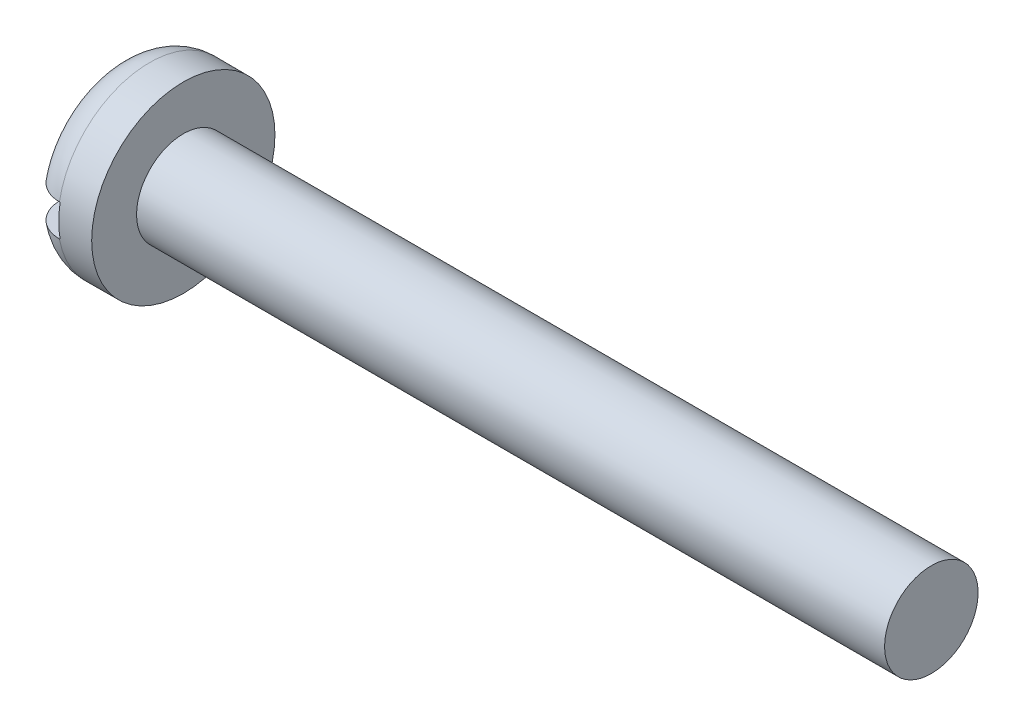
ISO-10303-21;
HEADER;
FILE_DESCRIPTION(('STEP AP214'),'2;1');
FILE_NAME('part.step','',(''),(''),'','','');
FILE_SCHEMA(('AUTOMOTIVE_DESIGN { 1 0 10303 214 1 1 1 1 }'));
ENDSEC;
DATA;
#1=APPLICATION_CONTEXT('core data for automotive mechanical design processes');
#2=APPLICATION_PROTOCOL_DEFINITION('international standard','automotive_design',2000,#1);
#3=PRODUCT_CONTEXT('',#1,'mechanical');
#4=PRODUCT('Part','Part','',(#3));
#5=PRODUCT_RELATED_PRODUCT_CATEGORY('part','',(#4));
#6=PRODUCT_DEFINITION_FORMATION('','',#4);
#7=PRODUCT_DEFINITION_CONTEXT('part definition',#1,'design');
#8=PRODUCT_DEFINITION('design','',#6,#7);
#9=PRODUCT_DEFINITION_SHAPE('','',#8);
#10=(LENGTH_UNIT() NAMED_UNIT(*) SI_UNIT(.MILLI.,.METRE.));
#11=(NAMED_UNIT(*) PLANE_ANGLE_UNIT() SI_UNIT($,.RADIAN.));
#12=(NAMED_UNIT(*) SI_UNIT($,.STERADIAN.) SOLID_ANGLE_UNIT());
#13=UNCERTAINTY_MEASURE_WITH_UNIT(LENGTH_MEASURE(1.E-05),#10,'distance_accuracy_value','');
#14=(GEOMETRIC_REPRESENTATION_CONTEXT(3) GLOBAL_UNCERTAINTY_ASSIGNED_CONTEXT((#13)) GLOBAL_UNIT_ASSIGNED_CONTEXT((#10,
#11,#12)) REPRESENTATION_CONTEXT('',''));
#15=CARTESIAN_POINT('',(0.,0.,0.));
#16=DIRECTION('',(0.,0.,1.));
#17=DIRECTION('',(1.,0.,0.));
#18=AXIS2_PLACEMENT_3D('',#15,#16,#17);
#19=CARTESIAN_POINT('',(1.143,0.5461,-3.1115));
#20=DIRECTION('',(-1.,0.,0.));
#21=DIRECTION('',(0.,0.,1.));
#22=AXIS2_PLACEMENT_3D('',#19,#20,#21);
#23=PLANE('',#22);
#24=DIRECTION('',(0.,0.,1.));
#25=VECTOR('',#24,1.);
#26=CARTESIAN_POINT('',(1.143,0.5461,3.1115));
#27=LINE('',#26,#25);
#28=CARTESIAN_POINT('',(1.143,0.5461,3.06320208931827));
#29=VERTEX_POINT('',#28);
#30=CARTESIAN_POINT('',(1.143,0.5461,-3.06320208931827));
#31=VERTEX_POINT('',#30);
#32=EDGE_CURVE('E65',#29,#31,#27,.F.);
#33=ORIENTED_EDGE('',*,*,#32,.T.);
#34=CARTESIAN_POINT('',(1.143,0.,0.));
#35=DIRECTION('',(-1.,0.,0.));
#36=DIRECTION('',(0.,0.,1.));
#37=AXIS2_PLACEMENT_3D('',#34,#35,#36);
#38=CIRCLE('',#37,3.1115);
#39=CARTESIAN_POINT('',(1.143,-0.5461,-3.06320208931827));
#40=VERTEX_POINT('',#39);
#41=EDGE_CURVE('E75',#31,#40,#38,.T.);
#42=ORIENTED_EDGE('',*,*,#41,.T.);
#43=DIRECTION('',(0.,0.,-1.));
#44=VECTOR('',#43,1.);
#45=CARTESIAN_POINT('',(1.143,-0.5461,-3.1115));
#46=LINE('',#45,#44);
#47=CARTESIAN_POINT('',(1.143,-0.5461,3.06320208931827));
#48=VERTEX_POINT('',#47);
#49=EDGE_CURVE('E73',#40,#48,#46,.F.);
#50=ORIENTED_EDGE('',*,*,#49,.T.);
#51=CARTESIAN_POINT('',(1.143,0.,0.));
#52=DIRECTION('',(-1.,0.,0.));
#53=DIRECTION('',(0.,0.,1.));
#54=AXIS2_PLACEMENT_3D('',#51,#52,#53);
#55=CIRCLE('',#54,3.1115);
#56=EDGE_CURVE('E19',#48,#29,#55,.T.);
#57=ORIENTED_EDGE('',*,*,#56,.T.);
#58=EDGE_LOOP('',(#33,#42,#50,#57));
#59=FACE_BOUND('',#58,.T.);
#60=ADVANCED_FACE('F16',(#59),#23,.T.);
#61=CARTESIAN_POINT('',(1.143,-0.5461,-3.1115));
#62=DIRECTION('',(0.,-1.,0.));
#63=DIRECTION('',(0.,0.,-1.));
#64=AXIS2_PLACEMENT_3D('',#61,#62,#63);
#65=PLANE('',#64);
#66=DIRECTION('',(1.,0.,0.));
#67=VECTOR('',#66,1.);
#68=CARTESIAN_POINT('',(1.143,-0.5461,3.0632020893189));
#69=LINE('',#68,#67);
#70=CARTESIAN_POINT('',(1.1176,-0.5461,3.06320208931827));
#71=VERTEX_POINT('',#70);
#72=EDGE_CURVE('E86',#48,#71,#69,.F.);
#73=ORIENTED_EDGE('',*,*,#72,.F.);
#74=ORIENTED_EDGE('',*,*,#49,.F.);
#75=DIRECTION('',(1.,0.,0.));
#76=VECTOR('',#75,1.);
#77=CARTESIAN_POINT('',(1.143,-0.5461,-3.0632020893189));
#78=LINE('',#77,#76);
#79=CARTESIAN_POINT('',(1.1176,-0.5461,-3.06320208931827));
#80=VERTEX_POINT('',#79);
#81=EDGE_CURVE('E84',#80,#40,#78,.T.);
#82=ORIENTED_EDGE('',*,*,#81,.F.);
#83=CARTESIAN_POINT('',(0.,-0.546100000000001,-1.91765794655883));
#84=CARTESIAN_POINT('',(-4.86585351610282E-07,-0.5461,-1.95062637866364));
#85=CARTESIAN_POINT('',(0.00135014506313673,-0.5461,-1.98358259298573));
#86=CARTESIAN_POINT('',(0.0067686016150952,-0.5461,-2.04927334553177));
#87=CARTESIAN_POINT('',(0.0108366631513076,-0.5461,-2.08200786419976));
#88=CARTESIAN_POINT('',(0.0271349413877521,-0.5461,-2.17954955418893));
#89=CARTESIAN_POINT('',(0.0434592295263024,-0.546100000000001,-2.24372027915941));
#90=CARTESIAN_POINT('',(0.086814129053496,-0.546100000000001,-2.36845554355077));
#91=CARTESIAN_POINT('',(0.113859878601486,-0.5461,-2.4290148441318));
#92=CARTESIAN_POINT('',(0.16190237578884,-0.5461,-2.51559533377862));
#93=CARTESIAN_POINT('',(0.179159773009867,-0.5461,-2.54374276145626));
#94=CARTESIAN_POINT('',(0.216075583473107,-0.5461,-2.59845900628358));
#95=CARTESIAN_POINT('',(0.235736442254006,-0.546099999999999,-2.62502617396701));
#96=CARTESIAN_POINT('',(0.297032177469674,-0.546099999999999,-2.70065627104591));
#97=CARTESIAN_POINT('',(0.341845840618247,-0.5461,-2.74719961308327));
#98=CARTESIAN_POINT('',(0.438810520549853,-0.5461,-2.8318776489374));
#99=CARTESIAN_POINT('',(0.490960095385904,-0.546099999999998,-2.87001399146155));
#100=CARTESIAN_POINT('',(0.572903803855602,-0.546099999999999,-2.91965052665071));
#101=CARTESIAN_POINT('',(0.600532288418432,-0.5461,-2.93481477161741));
#102=CARTESIAN_POINT('',(0.656951694036354,-0.5461,-2.96272487096258));
#103=CARTESIAN_POINT('',(0.685741576017605,-0.5461,-2.975472831381));
#104=CARTESIAN_POINT('',(0.773570258061908,-0.546099999999999,-3.00993924201506));
#105=CARTESIAN_POINT('',(0.834141002763517,-0.546099999999995,-3.02792433866405));
#106=CARTESIAN_POINT('',(0.93224294473862,-0.546100000000005,-3.04812139634171));
#107=CARTESIAN_POINT('',(0.969113431249231,-0.546100000000012,-3.05377399627333));
#108=CARTESIAN_POINT('',(1.0431813456879,-0.546099999999988,-3.06131179915604));
#109=CARTESIAN_POINT('',(1.08037819684364,-0.546099999999956,-3.06320266962121));
#110=CARTESIAN_POINT('',(1.11759999999993,-0.546099999999882,-3.06320208931766));
#111=B_SPLINE_CURVE_WITH_KNOTS('',3,(#83,#84,#85,#86,#87,#88,#89,#90,#91,#92,#93,#94,#95,#96,
#97,#98,#99,#100,#101,#102,#103,#104,#105,#106,#107,#108,#109,#110),.UNSPECIFIED.,.F.,.F.,(4,2,
2,2,2,2,2,2,2,2,2,2,2,4),(0.,0.0988519722488281,0.197712553611454,0.39535841236402,
0.593284336719768,0.692224546821263,0.791266280565482,0.984091274992725,1.17687842055746,
1.27132649663735,1.36569186911685,1.55417017095813,1.66590679181832,1.77747493966118),.UNSPECIFIED.);
#112=CARTESIAN_POINT('',(0.,-0.5461,-1.91765794655883));
#113=VERTEX_POINT('',#112);
#114=EDGE_CURVE('E80',#113,#80,#111,.T.);
#115=ORIENTED_EDGE('',*,*,#114,.F.);
#116=DIRECTION('',(0.,0.,1.));
#117=VECTOR('',#116,1.);
#118=CARTESIAN_POINT('',(0.,-0.5461,0.));
#119=LINE('',#118,#117);
#120=CARTESIAN_POINT('',(0.,-0.5461,1.91765794655883));
#121=VERTEX_POINT('',#120);
#122=EDGE_CURVE('E129',#121,#113,#119,.F.);
#123=ORIENTED_EDGE('',*,*,#122,.F.);
#124=CARTESIAN_POINT('',(1.1176,-0.546100000000001,3.06320208931765));
#125=CARTESIAN_POINT('',(1.08655171124809,-0.5461,3.06320255198409));
#126=CARTESIAN_POINT('',(1.05551728560532,-0.5461,3.06188720128157));
#127=CARTESIAN_POINT('',(0.993673927460179,-0.5461,3.05664149504699));
#128=CARTESIAN_POINT('',(0.962864968757371,-0.5461,3.05271144839587));
#129=CARTESIAN_POINT('',(0.871181911441144,-0.5461,3.03704424031997));
#130=CARTESIAN_POINT('',(0.810928303907086,-0.5461,3.02142986340667));
#131=CARTESIAN_POINT('',(0.693879264891046,-0.5461,2.98029734378209));
#132=CARTESIAN_POINT('',(0.637085147748696,-0.5461,2.95477546380094));
#133=CARTESIAN_POINT('',(0.555746384874976,-0.5461,2.90969338362253));
#134=CARTESIAN_POINT('',(0.529271204166917,-0.5461,2.89352936338644));
#135=CARTESIAN_POINT('',(0.477738255257114,-0.5461,2.85903394400874));
#136=CARTESIAN_POINT('',(0.452681777400283,-0.546099999999999,2.84070061720285));
#137=CARTESIAN_POINT('',(0.379729505108277,-0.546099999999998,2.78249002227685));
#138=CARTESIAN_POINT('',(0.334253602645311,-0.5461,2.73951479197486));
#139=CARTESIAN_POINT('',(0.251047861028869,-0.5461,2.6466262571059));
#140=CARTESIAN_POINT('',(0.213319017149381,-0.5461,2.59671206246145));
#141=CARTESIAN_POINT('',(0.163000801311553,-0.5461,2.51736960814786));
#142=CARTESIAN_POINT('',(0.147176090622323,-0.5461,2.48994586030756));
#143=CARTESIAN_POINT('',(0.1178622083208,-0.5461,2.43391145213047));
#144=CARTESIAN_POINT('',(0.104370920288527,-0.5461,2.40530189683708));
#145=CARTESIAN_POINT('',(0.0674933170593663,-0.5461,2.3179319352955));
#146=CARTESIAN_POINT('',(0.0476880002718061,-0.5461,2.25760606202138));
#147=CARTESIAN_POINT('',(0.0219024844533768,-0.5461,2.15053081830774));
#148=CARTESIAN_POINT('',(0.0136727204926522,-0.5461,2.10429914924586));
#149=CARTESIAN_POINT('',(0.00272220980386176,-0.5461,2.01126891000954));
#150=CARTESIAN_POINT('',(-8.19609578063764E-06,-0.5461,1.96447147929644));
#151=CARTESIAN_POINT('',(0.,-0.546100000000001,1.91765794655883));
#152=B_SPLINE_CURVE_WITH_KNOTS('',3,(#124,#125,#126,#127,#128,#129,#130,#131,#132,#133,#134,
#135,#136,#137,#138,#139,#140,#141,#142,#143,#144,#145,#146,#147,#148,#149,#150,#151),
.UNSPECIFIED.,.F.,.F.,(4,2,2,2,2,2,2,2,2,2,2,2,2,4),(0.,0.093089547880753,0.186168100799708,
0.371959999085716,0.557822049279223,0.65078586535665,0.743832919173213,0.930614005390173,
1.11741907260644,1.2123084639089,1.30711133375681,1.49663233650843,1.63720397872095,
1.77752850229943),.UNSPECIFIED.);
#153=EDGE_CURVE('E189',#71,#121,#152,.T.);
#154=ORIENTED_EDGE('',*,*,#153,.F.);
#155=EDGE_LOOP('',(#73,#74,#82,#115,#123,#154));
#156=FACE_BOUND('',#155,.T.);
#157=ADVANCED_FACE('F154',(#156),#65,.F.);
#158=CARTESIAN_POINT('',(0.,0.,0.));
#159=DIRECTION('',(-1.,0.,0.));
#160=DIRECTION('',(0.,0.,1.));
#161=AXIS2_PLACEMENT_3D('',#158,#159,#160);
#162=PLANE('',#161);
#163=ORIENTED_EDGE('',*,*,#122,.T.);
#164=CARTESIAN_POINT('',(0.,0.,0.));
#165=DIRECTION('',(1.,0.,0.));
#166=DIRECTION('',(0.,-0.273885350318463,0.961762348442136));
#167=AXIS2_PLACEMENT_3D('',#164,#165,#166);
#168=CIRCLE('',#167,1.99390000000006);
#169=EDGE_CURVE('E177',#121,#113,#168,.T.);
#170=ORIENTED_EDGE('',*,*,#169,.F.);
#171=EDGE_LOOP('',(#163,#170));
#172=FACE_BOUND('',#171,.T.);
#173=ADVANCED_FACE('F151',(#172),#162,.T.);
#174=CARTESIAN_POINT('',(0.,0.,0.));
#175=DIRECTION('',(-1.,0.,0.));
#176=DIRECTION('',(0.,0.,1.));
#177=AXIS2_PLACEMENT_3D('',#174,#175,#176);
#178=PLANE('',#177);
#179=DIRECTION('',(0.,0.,1.));
#180=VECTOR('',#179,1.);
#181=CARTESIAN_POINT('',(0.,0.5461,3.1115));
#182=LINE('',#181,#180);
#183=CARTESIAN_POINT('',(0.,0.5461,-1.91765794655883));
#184=VERTEX_POINT('',#183);
#185=CARTESIAN_POINT('',(0.,0.5461,1.91765794655883));
#186=VERTEX_POINT('',#185);
#187=EDGE_CURVE('E66',#184,#186,#182,.T.);
#188=ORIENTED_EDGE('',*,*,#187,.T.);
#189=CARTESIAN_POINT('',(0.,0.,0.));
#190=DIRECTION('',(1.,0.,0.));
#191=DIRECTION('',(0.,0.273885350318463,-0.961762348442136));
#192=AXIS2_PLACEMENT_3D('',#189,#190,#191);
#193=CIRCLE('',#192,1.99390000000006);
#194=EDGE_CURVE('E96',#184,#186,#193,.T.);
#195=ORIENTED_EDGE('',*,*,#194,.F.);
#196=EDGE_LOOP('',(#188,#195));
#197=FACE_BOUND('',#196,.T.);
#198=ADVANCED_FACE('F142',(#197),#178,.T.);
#199=CARTESIAN_POINT('',(1.143,0.5461,3.1115));
#200=DIRECTION('',(0.,1.,0.));
#201=DIRECTION('',(0.,0.,1.));
#202=AXIS2_PLACEMENT_3D('',#199,#200,#201);
#203=PLANE('',#202);
#204=DIRECTION('',(1.,0.,0.));
#205=VECTOR('',#204,1.);
#206=CARTESIAN_POINT('',(1.143,0.5461,-3.0632020893189));
#207=LINE('',#206,#205);
#208=CARTESIAN_POINT('',(1.1176,0.5461,-3.06320208931827));
#209=VERTEX_POINT('',#208);
#210=EDGE_CURVE('E78',#31,#209,#207,.F.);
#211=ORIENTED_EDGE('',*,*,#210,.F.);
#212=ORIENTED_EDGE('',*,*,#32,.F.);
#213=DIRECTION('',(1.,0.,0.));
#214=VECTOR('',#213,1.);
#215=CARTESIAN_POINT('',(1.143,0.5461,3.0632020893189));
#216=LINE('',#215,#214);
#217=CARTESIAN_POINT('',(1.1176,0.5461,3.06320208931827));
#218=VERTEX_POINT('',#217);
#219=EDGE_CURVE('E34',#218,#29,#216,.T.);
#220=ORIENTED_EDGE('',*,*,#219,.F.);
#221=CARTESIAN_POINT('',(0.,0.5461,1.91765794655883));
#222=CARTESIAN_POINT('',(-4.86585351693504E-07,0.5461,1.95062637866364));
#223=CARTESIAN_POINT('',(0.0013501450631366,0.5461,1.98358259298573));
#224=CARTESIAN_POINT('',(0.00676860161509502,0.5461,2.04927334553177));
#225=CARTESIAN_POINT('',(0.0108366631513075,0.5461,2.08200786419976));
#226=CARTESIAN_POINT('',(0.027134941387752,0.5461,2.17954955418893));
#227=CARTESIAN_POINT('',(0.0434592295263023,0.5461,2.24372027915941));
#228=CARTESIAN_POINT('',(0.086814129053496,0.5461,2.36845554355077));
#229=CARTESIAN_POINT('',(0.113859878601486,0.5461,2.4290148441318));
#230=CARTESIAN_POINT('',(0.16190237578884,0.5461,2.51559533377862));
#231=CARTESIAN_POINT('',(0.179159773009867,0.5461,2.54374276145626));
#232=CARTESIAN_POINT('',(0.216075583473107,0.5461,2.59845900628358));
#233=CARTESIAN_POINT('',(0.235736442254006,0.5461,2.62502617396701));
#234=CARTESIAN_POINT('',(0.297032177469674,0.5461,2.70065627104591));
#235=CARTESIAN_POINT('',(0.341845840618247,0.5461,2.74719961308327));
#236=CARTESIAN_POINT('',(0.438810520549853,0.5461,2.8318776489374));
#237=CARTESIAN_POINT('',(0.490960095385904,0.5461,2.87001399146154));
#238=CARTESIAN_POINT('',(0.572903803855602,0.5461,2.91965052665071));
#239=CARTESIAN_POINT('',(0.600532288418432,0.5461,2.93481477161741));
#240=CARTESIAN_POINT('',(0.656951694036354,0.5461,2.96272487096258));
#241=CARTESIAN_POINT('',(0.685741576017605,0.546100000000001,2.975472831381));
#242=CARTESIAN_POINT('',(0.773570258061908,0.546099999999999,3.00993924201506));
#243=CARTESIAN_POINT('',(0.834141002763517,0.546099999999993,3.02792433866405));
#244=CARTESIAN_POINT('',(0.93224294473862,0.546100000000003,3.0481213963417));
#245=CARTESIAN_POINT('',(0.969113431249231,0.546100000000012,3.05377399627333));
#246=CARTESIAN_POINT('',(1.0431813456879,0.546099999999988,3.06131179915604));
#247=CARTESIAN_POINT('',(1.08037819684364,0.546099999999957,3.06320266962121));
#248=CARTESIAN_POINT('',(1.11759999999993,0.546099999999881,3.06320208931766));
#249=B_SPLINE_CURVE_WITH_KNOTS('',3,(#221,#222,#223,#224,#225,#226,#227,#228,#229,#230,#231,
#232,#233,#234,#235,#236,#237,#238,#239,#240,#241,#242,#243,#244,#245,#246,#247,#248),
.UNSPECIFIED.,.F.,.F.,(4,2,2,2,2,2,2,2,2,2,2,2,2,4),(0.,0.0988519722488275,0.197712553611454,
0.395358412364021,0.593284336719768,0.692224546821263,0.791266280565482,0.984091274992725,
1.17687842055746,1.27132649663735,1.36569186911685,1.55417017095813,1.66590679181832,
1.77747493966118),.UNSPECIFIED.);
#250=EDGE_CURVE('E93',#186,#218,#249,.T.);
#251=ORIENTED_EDGE('',*,*,#250,.F.);
#252=ORIENTED_EDGE('',*,*,#187,.F.);
#253=CARTESIAN_POINT('',(1.1176,0.5461,-3.06320208931765));
#254=CARTESIAN_POINT('',(1.08655171124809,0.5461,-3.06320255198409));
#255=CARTESIAN_POINT('',(1.05551728560532,0.5461,-3.06188720128157));
#256=CARTESIAN_POINT('',(0.993673927460179,0.5461,-3.05664149504699));
#257=CARTESIAN_POINT('',(0.962864968757371,0.5461,-3.05271144839587));
#258=CARTESIAN_POINT('',(0.871181911441144,0.5461,-3.03704424031997));
#259=CARTESIAN_POINT('',(0.810928303907086,0.546099999999999,-3.02142986340667));
#260=CARTESIAN_POINT('',(0.693879264891046,0.546099999999999,-2.98029734378209));
#261=CARTESIAN_POINT('',(0.637085147748696,0.5461,-2.95477546380094));
#262=CARTESIAN_POINT('',(0.555746384874976,0.5461,-2.90969338362253));
#263=CARTESIAN_POINT('',(0.529271204166917,0.5461,-2.89352936338644));
#264=CARTESIAN_POINT('',(0.477738255257114,0.5461,-2.85903394400874));
#265=CARTESIAN_POINT('',(0.452681777400283,0.5461,-2.84070061720285));
#266=CARTESIAN_POINT('',(0.379729505108277,0.546100000000001,-2.78249002227685));
#267=CARTESIAN_POINT('',(0.334253602645312,0.5461,-2.73951479197486));
#268=CARTESIAN_POINT('',(0.25104786102887,0.546099999999999,-2.6466262571059));
#269=CARTESIAN_POINT('',(0.213319017149381,0.546099999999999,-2.59671206246146));
#270=CARTESIAN_POINT('',(0.163000801311553,0.546099999999999,-2.51736960814786));
#271=CARTESIAN_POINT('',(0.147176090622323,0.5461,-2.48994586030756));
#272=CARTESIAN_POINT('',(0.1178622083208,0.5461,-2.43391145213047));
#273=CARTESIAN_POINT('',(0.104370920288528,0.5461,-2.40530189683708));
#274=CARTESIAN_POINT('',(0.0674933170593666,0.5461,-2.3179319352955));
#275=CARTESIAN_POINT('',(0.0476880002718063,0.5461,-2.25760606202138));
#276=CARTESIAN_POINT('',(0.021902484453377,0.5461,-2.15053081830774));
#277=CARTESIAN_POINT('',(0.0136727204926525,0.5461,-2.10429914924586));
#278=CARTESIAN_POINT('',(0.00272220980386205,0.5461,-2.01126891000955));
#279=CARTESIAN_POINT('',(-8.19609578039734E-06,0.5461,-1.96447147929644));
#280=CARTESIAN_POINT('',(0.,0.5461,-1.91765794655883));
#281=B_SPLINE_CURVE_WITH_KNOTS('',3,(#253,#254,#255,#256,#257,#258,#259,#260,#261,#262,#263,
#264,#265,#266,#267,#268,#269,#270,#271,#272,#273,#274,#275,#276,#277,#278,#279,#280),
.UNSPECIFIED.,.F.,.F.,(4,2,2,2,2,2,2,2,2,2,2,2,2,4),(0.,0.0930895478807528,0.186168100799708,
0.371959999085716,0.557822049279223,0.650785865356649,0.743832919173213,0.930614005390172,
1.11741907260644,1.2123084639089,1.30711133375681,1.49663233650843,1.63720397872095,
1.77752850229943),.UNSPECIFIED.);
#282=EDGE_CURVE('E104',#209,#184,#281,.T.);
#283=ORIENTED_EDGE('',*,*,#282,.F.);
#284=EDGE_LOOP('',(#211,#212,#220,#251,#252,#283));
#285=FACE_BOUND('',#284,.T.);
#286=ADVANCED_FACE('F76',(#285),#203,.F.);
#287=CARTESIAN_POINT('',(1.1176,0.,0.));
#288=DIRECTION('',(-1.,0.,0.));
#289=DIRECTION('',(0.,0.,1.));
#290=AXIS2_PLACEMENT_3D('',#287,#288,#289);
#291=TOROIDAL_SURFACE('',#290,1.9939,1.1176);
#292=ORIENTED_EDGE('',*,*,#153,.T.);
#293=ORIENTED_EDGE('',*,*,#169,.T.);
#294=ORIENTED_EDGE('',*,*,#114,.T.);
#295=CARTESIAN_POINT('',(1.1176,0.,0.));
#296=DIRECTION('',(-1.,0.,0.));
#297=DIRECTION('',(0.,0.,1.));
#298=AXIS2_PLACEMENT_3D('',#295,#296,#297);
#299=CIRCLE('',#298,3.1115);
#300=EDGE_CURVE('E95',#71,#80,#299,.F.);
#301=ORIENTED_EDGE('',*,*,#300,.F.);
#302=EDGE_LOOP('',(#292,#293,#294,#301));
#303=FACE_BOUND('',#302,.T.);
#304=ADVANCED_FACE('F114',(#303),#291,.T.);
#305=CARTESIAN_POINT('',(1.1176,0.,0.));
#306=DIRECTION('',(-1.,0.,0.));
#307=DIRECTION('',(0.,0.,1.));
#308=AXIS2_PLACEMENT_3D('',#305,#306,#307);
#309=TOROIDAL_SURFACE('',#308,1.9939,1.1176);
#310=ORIENTED_EDGE('',*,*,#250,.T.);
#311=CARTESIAN_POINT('',(1.1176,0.,0.));
#312=DIRECTION('',(-1.,0.,0.));
#313=DIRECTION('',(0.,0.,1.));
#314=AXIS2_PLACEMENT_3D('',#311,#312,#313);
#315=CIRCLE('',#314,3.1115);
#316=EDGE_CURVE('E64',#209,#218,#315,.F.);
#317=ORIENTED_EDGE('',*,*,#316,.F.);
#318=ORIENTED_EDGE('',*,*,#282,.T.);
#319=ORIENTED_EDGE('',*,*,#194,.T.);
#320=EDGE_LOOP('',(#310,#317,#318,#319));
#321=FACE_BOUND('',#320,.T.);
#322=ADVANCED_FACE('F109',(#321),#309,.T.);
#323=CARTESIAN_POINT('',(-25.4,0.,0.));
#324=DIRECTION('',(-1.,0.,0.));
#325=DIRECTION('',(0.,0.,1.));
#326=AXIS2_PLACEMENT_3D('',#323,#324,#325);
#327=CYLINDRICAL_SURFACE('',#326,3.1115);
#328=ORIENTED_EDGE('',*,*,#316,.T.);
#329=ORIENTED_EDGE('',*,*,#219,.T.);
#330=ORIENTED_EDGE('',*,*,#56,.F.);
#331=ORIENTED_EDGE('',*,*,#72,.T.);
#332=ORIENTED_EDGE('',*,*,#300,.T.);
#333=ORIENTED_EDGE('',*,*,#81,.T.);
#334=ORIENTED_EDGE('',*,*,#41,.F.);
#335=ORIENTED_EDGE('',*,*,#210,.T.);
#336=EDGE_LOOP('',(#328,#329,#330,#331,#332,#333,#334,#335));
#337=FACE_BOUND('',#336,.T.);
#338=CARTESIAN_POINT('',(2.2606,0.,0.));
#339=DIRECTION('',(-1.,0.,0.));
#340=DIRECTION('',(0.,0.,1.));
#341=AXIS2_PLACEMENT_3D('',#338,#339,#340);
#342=CIRCLE('',#341,3.1115);
#343=CARTESIAN_POINT('',(2.2606,0.,3.1115));
#344=VERTEX_POINT('',#343);
#345=EDGE_CURVE('E90',#344,#344,#342,.T.);
#346=ORIENTED_EDGE('',*,*,#345,.T.);
#347=EDGE_LOOP('',(#346));
#348=FACE_BOUND('',#347,.T.);
#349=ADVANCED_FACE('F61',(#337,#348),#327,.T.);
#350=CARTESIAN_POINT('',(27.6606,1.5875,0.));
#351=DIRECTION('',(1.,0.,0.));
#352=DIRECTION('',(0.,0.,-1.));
#353=AXIS2_PLACEMENT_3D('',#350,#351,#352);
#354=PLANE('',#353);
#355=CARTESIAN_POINT('',(27.6606,0.,0.));
#356=DIRECTION('',(-1.,0.,0.));
#357=DIRECTION('',(0.,0.,1.));
#358=AXIS2_PLACEMENT_3D('',#355,#356,#357);
#359=CIRCLE('',#358,1.5875);
#360=CARTESIAN_POINT('',(27.6606,0.,1.5875));
#361=VERTEX_POINT('',#360);
#362=EDGE_CURVE('E25',#361,#361,#359,.T.);
#363=ORIENTED_EDGE('',*,*,#362,.F.);
#364=EDGE_LOOP('',(#363));
#365=FACE_BOUND('',#364,.T.);
#366=ADVANCED_FACE('F223',(#365),#354,.T.);
#367=CARTESIAN_POINT('',(2.2606,1.5875,0.));
#368=DIRECTION('',(-1.,0.,0.));
#369=DIRECTION('',(0.,0.,1.));
#370=AXIS2_PLACEMENT_3D('',#367,#368,#369);
#371=PLANE('',#370);
#372=CARTESIAN_POINT('',(2.2606,0.,0.));
#373=DIRECTION('',(-1.,0.,0.));
#374=DIRECTION('',(0.,0.,1.));
#375=AXIS2_PLACEMENT_3D('',#372,#373,#374);
#376=CIRCLE('',#375,1.5875);
#377=CARTESIAN_POINT('',(2.2606,0.,1.5875));
#378=VERTEX_POINT('',#377);
#379=EDGE_CURVE('E11',#378,#378,#376,.F.);
#380=ORIENTED_EDGE('',*,*,#379,.F.);
#381=EDGE_LOOP('',(#380));
#382=FACE_BOUND('',#381,.T.);
#383=ORIENTED_EDGE('',*,*,#345,.F.);
#384=EDGE_LOOP('',(#383));
#385=FACE_BOUND('',#384,.T.);
#386=ADVANCED_FACE('F217',(#382,#385),#371,.F.);
#387=CARTESIAN_POINT('',(-25.4,0.,0.));
#388=DIRECTION('',(-1.,0.,0.));
#389=DIRECTION('',(0.,0.,1.));
#390=AXIS2_PLACEMENT_3D('',#387,#388,#389);
#391=CYLINDRICAL_SURFACE('',#390,1.5875);
#392=ORIENTED_EDGE('',*,*,#379,.T.);
#393=EDGE_LOOP('',(#392));
#394=FACE_BOUND('',#393,.T.);
#395=ORIENTED_EDGE('',*,*,#362,.T.);
#396=EDGE_LOOP('',(#395));
#397=FACE_BOUND('',#396,.T.);
#398=ADVANCED_FACE('F215',(#394,#397),#391,.T.);
#399=CLOSED_SHELL('',(#60,#157,#173,#198,#286,#304,#322,#349,#366,#386,#398));
#400=MANIFOLD_SOLID_BREP('B1',#399);
#401=ADVANCED_BREP_SHAPE_REPRESENTATION('',(#18,#400),#14);
#402=SHAPE_DEFINITION_REPRESENTATION(#9,#401);
ENDSEC;
END-ISO-10303-21;
